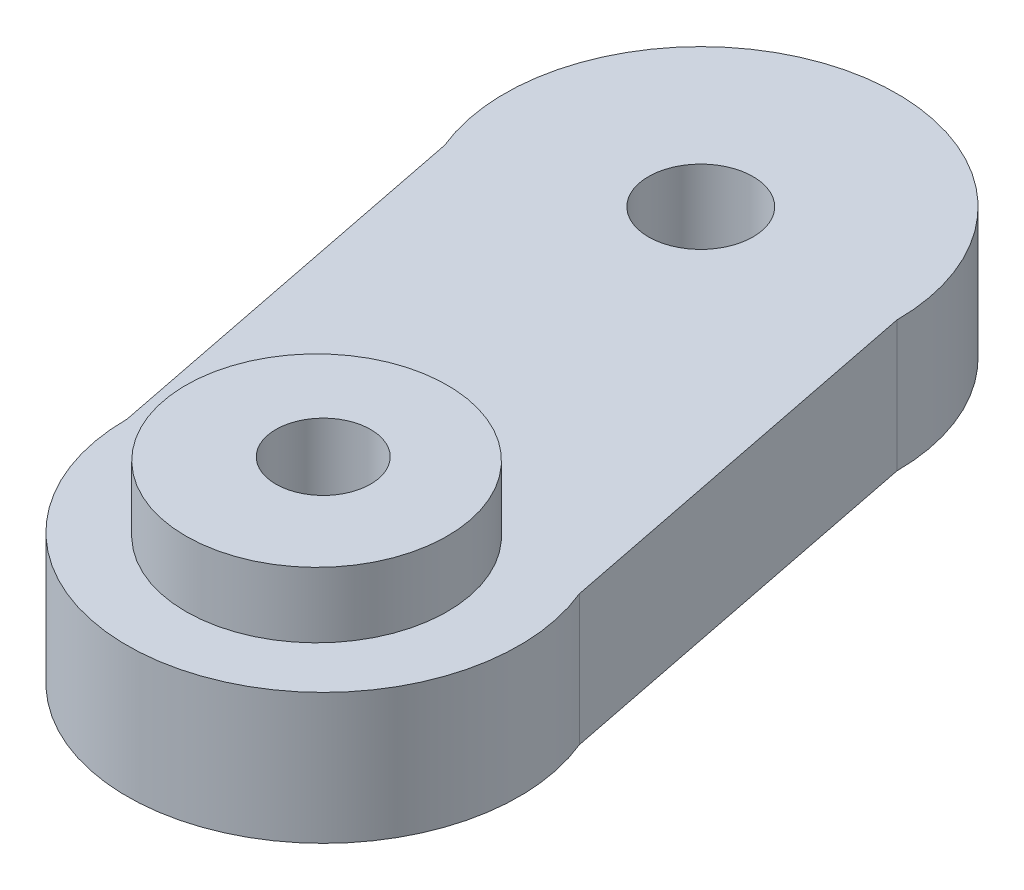
ISO-10303-21;
HEADER;
FILE_DESCRIPTION(('STEP AP214'),'2;1');
FILE_NAME('part.step','',(''),(''),'','','');
FILE_SCHEMA(('AUTOMOTIVE_DESIGN { 1 0 10303 214 1 1 1 1 }'));
ENDSEC;
DATA;
#1=APPLICATION_CONTEXT('core data for automotive mechanical design processes');
#2=APPLICATION_PROTOCOL_DEFINITION('international standard','automotive_design',2000,#1);
#3=PRODUCT_CONTEXT('',#1,'mechanical');
#4=PRODUCT('Part','Part','',(#3));
#5=PRODUCT_RELATED_PRODUCT_CATEGORY('part','',(#4));
#6=PRODUCT_DEFINITION_FORMATION('','',#4);
#7=PRODUCT_DEFINITION_CONTEXT('part definition',#1,'design');
#8=PRODUCT_DEFINITION('design','',#6,#7);
#9=PRODUCT_DEFINITION_SHAPE('','',#8);
#10=(LENGTH_UNIT() NAMED_UNIT(*) SI_UNIT(.MILLI.,.METRE.));
#11=(NAMED_UNIT(*) PLANE_ANGLE_UNIT() SI_UNIT($,.RADIAN.));
#12=(NAMED_UNIT(*) SI_UNIT($,.STERADIAN.) SOLID_ANGLE_UNIT());
#13=UNCERTAINTY_MEASURE_WITH_UNIT(LENGTH_MEASURE(1.E-05),#10,'distance_accuracy_value','');
#14=(GEOMETRIC_REPRESENTATION_CONTEXT(3) GLOBAL_UNCERTAINTY_ASSIGNED_CONTEXT((#13)) GLOBAL_UNIT_ASSIGNED_CONTEXT((#10,
#11,#12)) REPRESENTATION_CONTEXT('',''));
#15=CARTESIAN_POINT('',(0.,0.,0.));
#16=DIRECTION('',(0.,0.,1.));
#17=DIRECTION('',(1.,0.,0.));
#18=AXIS2_PLACEMENT_3D('',#15,#16,#17);
#19=CARTESIAN_POINT('',(2.84999999999998,4.,14.4));
#20=DIRECTION('',(0.,1.,0.));
#21=DIRECTION('',(0.,0.,1.));
#22=AXIS2_PLACEMENT_3D('',#19,#20,#21);
#23=PLANE('',#22);
#24=CARTESIAN_POINT('',(2.84999999999998,4.,14.4));
#25=DIRECTION('',(0.,1.,0.));
#26=DIRECTION('',(0.,0.,1.));
#27=AXIS2_PLACEMENT_3D('',#24,#25,#26);
#28=CIRCLE('',#27,6.);
#29=CARTESIAN_POINT('',(-3.15000000000002,4.,14.4));
#30=VERTEX_POINT('',#29);
#31=CARTESIAN_POINT('',(8.39766628380494,4.,12.1145243813303));
#32=VERTEX_POINT('',#31);
#33=EDGE_CURVE('E85',#30,#32,#28,.T.);
#34=ORIENTED_EDGE('',*,*,#33,.T.);
#35=DIRECTION('',(-0.194150653744939,0.,-0.98097172418496));
#36=VECTOR('',#35,1.);
#37=CARTESIAN_POINT('',(8.39766628380494,4.,12.1145243813303));
#38=LINE('',#37,#36);
#39=CARTESIAN_POINT('',(6.,4.,0.));
#40=VERTEX_POINT('',#39);
#41=EDGE_CURVE('E80',#32,#40,#38,.T.);
#42=ORIENTED_EDGE('',*,*,#41,.T.);
#43=CARTESIAN_POINT('',(0.,4.,0.));
#44=DIRECTION('',(0.,1.,0.));
#45=DIRECTION('',(0.,0.,1.));
#46=AXIS2_PLACEMENT_3D('',#43,#44,#45);
#47=CIRCLE('',#46,6.);
#48=CARTESIAN_POINT('',(-5.54766628380496,4.,2.28547561866972));
#49=VERTEX_POINT('',#48);
#50=EDGE_CURVE('E83',#40,#49,#47,.T.);
#51=ORIENTED_EDGE('',*,*,#50,.T.);
#52=DIRECTION('',(0.194150653744939,0.,0.98097172418496));
#53=VECTOR('',#52,1.);
#54=CARTESIAN_POINT('',(-5.54766628380496,4.,2.28547561866972));
#55=LINE('',#54,#53);
#56=EDGE_CURVE('E50',#49,#30,#55,.T.);
#57=ORIENTED_EDGE('',*,*,#56,.T.);
#58=EDGE_LOOP('',(#34,#42,#51,#57));
#59=FACE_BOUND('',#58,.T.);
#60=CARTESIAN_POINT('',(0.,4.,0.));
#61=DIRECTION('',(0.,1.,0.));
#62=DIRECTION('',(0.,0.,1.));
#63=AXIS2_PLACEMENT_3D('',#60,#61,#62);
#64=CIRCLE('',#63,1.6);
#65=CARTESIAN_POINT('',(0.,4.,1.6));
#66=VERTEX_POINT('',#65);
#67=EDGE_CURVE('E100',#66,#66,#64,.T.);
#68=ORIENTED_EDGE('',*,*,#67,.F.);
#69=EDGE_LOOP('',(#68));
#70=FACE_BOUND('',#69,.T.);
#71=CARTESIAN_POINT('',(2.84999999999998,4.,14.6026374589496));
#72=DIRECTION('',(0.,1.,0.));
#73=DIRECTION('',(0.,0.,1.));
#74=AXIS2_PLACEMENT_3D('',#71,#72,#73);
#75=CIRCLE('',#74,4.);
#76=CARTESIAN_POINT('',(2.84999999999998,4.,18.6026374589496));
#77=VERTEX_POINT('',#76);
#78=EDGE_CURVE('E121',#77,#77,#75,.T.);
#79=ORIENTED_EDGE('',*,*,#78,.F.);
#80=EDGE_LOOP('',(#79));
#81=FACE_BOUND('',#80,.T.);
#82=ADVANCED_FACE('F33',(#59,#70,#81),#23,.T.);
#83=CARTESIAN_POINT('',(2.84999999999998,0.,14.4));
#84=DIRECTION('',(0.,1.,0.));
#85=DIRECTION('',(0.,0.,1.));
#86=AXIS2_PLACEMENT_3D('',#83,#84,#85);
#87=PLANE('',#86);
#88=CARTESIAN_POINT('',(2.84999999999998,0.,14.4));
#89=DIRECTION('',(0.,1.,0.));
#90=DIRECTION('',(0.,0.,1.));
#91=AXIS2_PLACEMENT_3D('',#88,#89,#90);
#92=CIRCLE('',#91,6.);
#93=CARTESIAN_POINT('',(-3.15000000000002,0.,14.4));
#94=VERTEX_POINT('',#93);
#95=CARTESIAN_POINT('',(8.39766628380494,0.,12.1145243813303));
#96=VERTEX_POINT('',#95);
#97=EDGE_CURVE('E97',#94,#96,#92,.T.);
#98=ORIENTED_EDGE('',*,*,#97,.F.);
#99=DIRECTION('',(0.194150653744939,0.,0.98097172418496));
#100=VECTOR('',#99,1.);
#101=CARTESIAN_POINT('',(-5.54766628380496,0.,2.28547561866972));
#102=LINE('',#101,#100);
#103=CARTESIAN_POINT('',(-5.54766628380496,0.,2.28547561866972));
#104=VERTEX_POINT('',#103);
#105=EDGE_CURVE('E73',#104,#94,#102,.T.);
#106=ORIENTED_EDGE('',*,*,#105,.F.);
#107=CARTESIAN_POINT('',(0.,0.,0.));
#108=DIRECTION('',(0.,1.,0.));
#109=DIRECTION('',(0.,0.,1.));
#110=AXIS2_PLACEMENT_3D('',#107,#108,#109);
#111=CIRCLE('',#110,6.);
#112=CARTESIAN_POINT('',(6.,0.,0.));
#113=VERTEX_POINT('',#112);
#114=EDGE_CURVE('E67',#113,#104,#111,.T.);
#115=ORIENTED_EDGE('',*,*,#114,.F.);
#116=DIRECTION('',(-0.194150653744939,0.,-0.98097172418496));
#117=VECTOR('',#116,1.);
#118=CARTESIAN_POINT('',(8.39766628380494,0.,12.1145243813303));
#119=LINE('',#118,#117);
#120=EDGE_CURVE('E89',#96,#113,#119,.T.);
#121=ORIENTED_EDGE('',*,*,#120,.F.);
#122=EDGE_LOOP('',(#98,#106,#115,#121));
#123=FACE_BOUND('',#122,.T.);
#124=CARTESIAN_POINT('',(0.,0.,0.));
#125=DIRECTION('',(0.,1.,0.));
#126=DIRECTION('',(0.,0.,1.));
#127=AXIS2_PLACEMENT_3D('',#124,#125,#126);
#128=CIRCLE('',#127,1.6);
#129=CARTESIAN_POINT('',(0.,0.,1.6));
#130=VERTEX_POINT('',#129);
#131=EDGE_CURVE('E112',#130,#130,#128,.T.);
#132=ORIENTED_EDGE('',*,*,#131,.T.);
#133=EDGE_LOOP('',(#132));
#134=FACE_BOUND('',#133,.T.);
#135=CARTESIAN_POINT('',(2.84999999999998,0.,14.4));
#136=DIRECTION('',(0.,1.,0.));
#137=DIRECTION('',(0.,0.,1.));
#138=AXIS2_PLACEMENT_3D('',#135,#136,#137);
#139=CIRCLE('',#138,1.45);
#140=CARTESIAN_POINT('',(2.84999999999998,0.,15.85));
#141=VERTEX_POINT('',#140);
#142=EDGE_CURVE('E115',#141,#141,#139,.T.);
#143=ORIENTED_EDGE('',*,*,#142,.T.);
#144=EDGE_LOOP('',(#143));
#145=FACE_BOUND('',#144,.T.);
#146=ADVANCED_FACE('F108',(#123,#134,#145),#87,.F.);
#147=CARTESIAN_POINT('',(2.84999999999998,4.,14.4));
#148=DIRECTION('',(0.,-1.,0.));
#149=DIRECTION('',(0.,0.,-1.));
#150=AXIS2_PLACEMENT_3D('',#147,#148,#149);
#151=CYLINDRICAL_SURFACE('',#150,6.);
#152=ORIENTED_EDGE('',*,*,#97,.T.);
#153=DIRECTION('',(0.,-1.,0.));
#154=VECTOR('',#153,1.);
#155=CARTESIAN_POINT('',(8.39766628380494,4.,12.1145243813303));
#156=LINE('',#155,#154);
#157=EDGE_CURVE('E11',#32,#96,#156,.T.);
#158=ORIENTED_EDGE('',*,*,#157,.F.);
#159=ORIENTED_EDGE('',*,*,#33,.F.);
#160=DIRECTION('',(0.,-1.,0.));
#161=VECTOR('',#160,1.);
#162=CARTESIAN_POINT('',(-3.15000000000002,4.,14.4));
#163=LINE('',#162,#161);
#164=EDGE_CURVE('E93',#30,#94,#163,.T.);
#165=ORIENTED_EDGE('',*,*,#164,.T.);
#166=EDGE_LOOP('',(#152,#158,#159,#165));
#167=FACE_BOUND('',#166,.T.);
#168=ADVANCED_FACE('F35',(#167),#151,.T.);
#169=CARTESIAN_POINT('',(8.39766628380494,4.,12.1145243813303));
#170=DIRECTION('',(-0.98097172418496,0.,0.194150653744939));
#171=DIRECTION('',(0.194150653744939,0.,0.98097172418496));
#172=AXIS2_PLACEMENT_3D('',#169,#170,#171);
#173=PLANE('',#172);
#174=ORIENTED_EDGE('',*,*,#120,.T.);
#175=DIRECTION('',(0.,-1.,0.));
#176=VECTOR('',#175,1.);
#177=CARTESIAN_POINT('',(6.,4.,0.));
#178=LINE('',#177,#176);
#179=EDGE_CURVE('E42',#40,#113,#178,.T.);
#180=ORIENTED_EDGE('',*,*,#179,.F.);
#181=ORIENTED_EDGE('',*,*,#41,.F.);
#182=ORIENTED_EDGE('',*,*,#157,.T.);
#183=EDGE_LOOP('',(#174,#180,#181,#182));
#184=FACE_BOUND('',#183,.T.);
#185=ADVANCED_FACE('F88',(#184),#173,.F.);
#186=CARTESIAN_POINT('',(0.,4.,0.));
#187=DIRECTION('',(0.,-1.,0.));
#188=DIRECTION('',(0.,0.,-1.));
#189=AXIS2_PLACEMENT_3D('',#186,#187,#188);
#190=CYLINDRICAL_SURFACE('',#189,6.);
#191=ORIENTED_EDGE('',*,*,#114,.T.);
#192=DIRECTION('',(0.,-1.,0.));
#193=VECTOR('',#192,1.);
#194=CARTESIAN_POINT('',(-5.54766628380496,4.,2.28547561866972));
#195=LINE('',#194,#193);
#196=EDGE_CURVE('E90',#49,#104,#195,.T.);
#197=ORIENTED_EDGE('',*,*,#196,.F.);
#198=ORIENTED_EDGE('',*,*,#50,.F.);
#199=ORIENTED_EDGE('',*,*,#179,.T.);
#200=EDGE_LOOP('',(#191,#197,#198,#199));
#201=FACE_BOUND('',#200,.T.);
#202=ADVANCED_FACE('F91',(#201),#190,.T.);
#203=CARTESIAN_POINT('',(-5.54766628380496,4.,2.28547561866972));
#204=DIRECTION('',(0.98097172418496,0.,-0.194150653744939));
#205=DIRECTION('',(-0.194150653744939,0.,-0.98097172418496));
#206=AXIS2_PLACEMENT_3D('',#203,#204,#205);
#207=PLANE('',#206);
#208=ORIENTED_EDGE('',*,*,#105,.T.);
#209=ORIENTED_EDGE('',*,*,#164,.F.);
#210=ORIENTED_EDGE('',*,*,#56,.F.);
#211=ORIENTED_EDGE('',*,*,#196,.T.);
#212=EDGE_LOOP('',(#208,#209,#210,#211));
#213=FACE_BOUND('',#212,.T.);
#214=ADVANCED_FACE('F105',(#213),#207,.F.);
#215=CARTESIAN_POINT('',(0.,4.,0.));
#216=DIRECTION('',(0.,-1.,0.));
#217=DIRECTION('',(0.,0.,-1.));
#218=AXIS2_PLACEMENT_3D('',#215,#216,#217);
#219=CYLINDRICAL_SURFACE('',#218,1.6);
#220=ORIENTED_EDGE('',*,*,#67,.T.);
#221=EDGE_LOOP('',(#220));
#222=FACE_BOUND('',#221,.T.);
#223=ORIENTED_EDGE('',*,*,#131,.F.);
#224=EDGE_LOOP('',(#223));
#225=FACE_BOUND('',#224,.T.);
#226=ADVANCED_FACE('F143',(#222,#225),#219,.F.);
#227=CARTESIAN_POINT('',(2.84999999999998,4.,14.4));
#228=DIRECTION('',(0.,-1.,0.));
#229=DIRECTION('',(0.,0.,-1.));
#230=AXIS2_PLACEMENT_3D('',#227,#228,#229);
#231=CYLINDRICAL_SURFACE('',#230,1.45);
#232=ORIENTED_EDGE('',*,*,#142,.F.);
#233=EDGE_LOOP('',(#232));
#234=FACE_BOUND('',#233,.T.);
#235=CARTESIAN_POINT('',(2.84999999999998,6.,14.4));
#236=DIRECTION('',(0.,1.,0.));
#237=DIRECTION('',(0.,0.,1.));
#238=AXIS2_PLACEMENT_3D('',#235,#236,#237);
#239=CIRCLE('',#238,1.45);
#240=CARTESIAN_POINT('',(2.84999999999998,6.,15.85));
#241=VERTEX_POINT('',#240);
#242=EDGE_CURVE('E124',#241,#241,#239,.T.);
#243=ORIENTED_EDGE('',*,*,#242,.T.);
#244=EDGE_LOOP('',(#243));
#245=FACE_BOUND('',#244,.T.);
#246=ADVANCED_FACE('F130',(#234,#245),#231,.F.);
#247=CARTESIAN_POINT('',(2.84999999999998,6.,14.6026374589496));
#248=DIRECTION('',(0.,1.,0.));
#249=DIRECTION('',(0.,0.,1.));
#250=AXIS2_PLACEMENT_3D('',#247,#248,#249);
#251=PLANE('',#250);
#252=CARTESIAN_POINT('',(2.84999999999998,6.,14.6026374589496));
#253=DIRECTION('',(0.,1.,0.));
#254=DIRECTION('',(0.,0.,1.));
#255=AXIS2_PLACEMENT_3D('',#252,#253,#254);
#256=CIRCLE('',#255,4.);
#257=CARTESIAN_POINT('',(2.84999999999998,6.,18.6026374589496));
#258=VERTEX_POINT('',#257);
#259=EDGE_CURVE('E120',#258,#258,#256,.T.);
#260=ORIENTED_EDGE('',*,*,#259,.T.);
#261=EDGE_LOOP('',(#260));
#262=FACE_BOUND('',#261,.T.);
#263=ORIENTED_EDGE('',*,*,#242,.F.);
#264=EDGE_LOOP('',(#263));
#265=FACE_BOUND('',#264,.T.);
#266=ADVANCED_FACE('F132',(#262,#265),#251,.T.);
#267=CARTESIAN_POINT('',(2.84999999999998,6.,14.6026374589496));
#268=DIRECTION('',(0.,-1.,0.));
#269=DIRECTION('',(0.,0.,-1.));
#270=AXIS2_PLACEMENT_3D('',#267,#268,#269);
#271=CYLINDRICAL_SURFACE('',#270,4.);
#272=ORIENTED_EDGE('',*,*,#259,.F.);
#273=EDGE_LOOP('',(#272));
#274=FACE_BOUND('',#273,.T.);
#275=ORIENTED_EDGE('',*,*,#78,.T.);
#276=EDGE_LOOP('',(#275));
#277=FACE_BOUND('',#276,.T.);
#278=ADVANCED_FACE('F134',(#274,#277),#271,.T.);
#279=CLOSED_SHELL('',(#82,#146,#168,#185,#202,#214,#226,#246,#266,#278));
#280=MANIFOLD_SOLID_BREP('B2',#279);
#281=ADVANCED_BREP_SHAPE_REPRESENTATION('',(#18,#280),#14);
#282=SHAPE_DEFINITION_REPRESENTATION(#9,#281);
ENDSEC;
END-ISO-10303-21;
